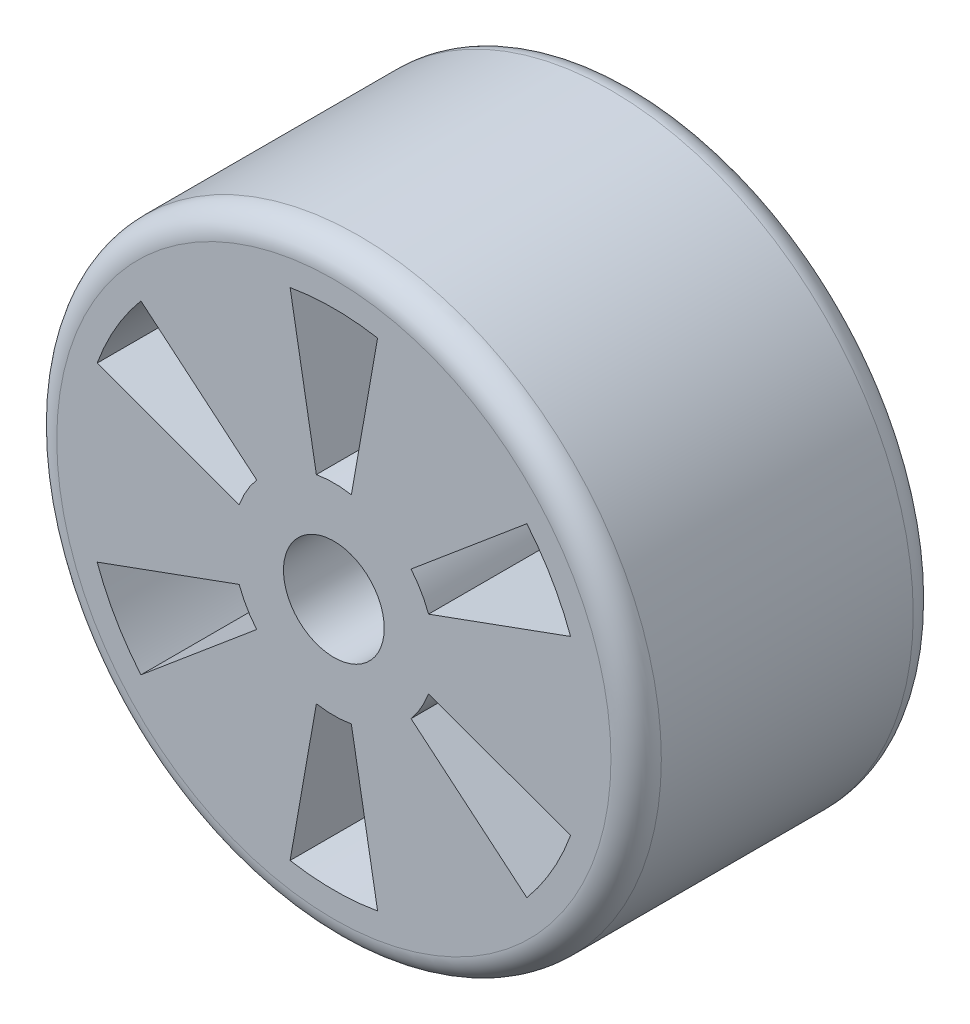
ISO-10303-21;
HEADER;
FILE_DESCRIPTION(('STEP AP214'),'2;1');
FILE_NAME('part.step','',(''),(''),'','','');
FILE_SCHEMA(('AUTOMOTIVE_DESIGN { 1 0 10303 214 1 1 1 1 }'));
ENDSEC;
DATA;
#1=APPLICATION_CONTEXT('core data for automotive mechanical design processes');
#2=APPLICATION_PROTOCOL_DEFINITION('international standard','automotive_design',2000,#1);
#3=PRODUCT_CONTEXT('',#1,'mechanical');
#4=PRODUCT('Part','Part','',(#3));
#5=PRODUCT_RELATED_PRODUCT_CATEGORY('part','',(#4));
#6=PRODUCT_DEFINITION_FORMATION('','',#4);
#7=PRODUCT_DEFINITION_CONTEXT('part definition',#1,'design');
#8=PRODUCT_DEFINITION('design','',#6,#7);
#9=PRODUCT_DEFINITION_SHAPE('','',#8);
#10=(LENGTH_UNIT() NAMED_UNIT(*) SI_UNIT(.MILLI.,.METRE.));
#11=(NAMED_UNIT(*) PLANE_ANGLE_UNIT() SI_UNIT($,.RADIAN.));
#12=(NAMED_UNIT(*) SI_UNIT($,.STERADIAN.) SOLID_ANGLE_UNIT());
#13=UNCERTAINTY_MEASURE_WITH_UNIT(LENGTH_MEASURE(1.E-05),#10,'distance_accuracy_value','');
#14=(GEOMETRIC_REPRESENTATION_CONTEXT(3) GLOBAL_UNCERTAINTY_ASSIGNED_CONTEXT((#13)) GLOBAL_UNIT_ASSIGNED_CONTEXT((#10,
#11,#12)) REPRESENTATION_CONTEXT('',''));
#15=CARTESIAN_POINT('',(0.,0.,0.));
#16=DIRECTION('',(0.,0.,1.));
#17=DIRECTION('',(1.,0.,0.));
#18=AXIS2_PLACEMENT_3D('',#15,#16,#17);
#19=CARTESIAN_POINT('',(0.,0.,-60.));
#20=DIRECTION('',(0.,0.,1.));
#21=DIRECTION('',(1.,0.,0.));
#22=AXIS2_PLACEMENT_3D('',#19,#20,#21);
#23=CYLINDRICAL_SURFACE('',#22,60.);
#24=CARTESIAN_POINT('',(0.,0.,-55.));
#25=DIRECTION('',(0.,0.,1.));
#26=DIRECTION('',(1.,0.,0.));
#27=AXIS2_PLACEMENT_3D('',#24,#25,#26);
#28=CIRCLE('',#27,60.);
#29=CARTESIAN_POINT('',(60.,0.,-55.));
#30=VERTEX_POINT('',#29);
#31=EDGE_CURVE('E482',#30,#30,#28,.T.);
#32=ORIENTED_EDGE('',*,*,#31,.T.);
#33=EDGE_LOOP('',(#32));
#34=FACE_BOUND('',#33,.T.);
#35=CARTESIAN_POINT('',(0.,0.,-5.));
#36=DIRECTION('',(0.,0.,1.));
#37=DIRECTION('',(1.,0.,0.));
#38=AXIS2_PLACEMENT_3D('',#35,#36,#37);
#39=CIRCLE('',#38,60.);
#40=CARTESIAN_POINT('',(60.,0.,-5.));
#41=VERTEX_POINT('',#40);
#42=EDGE_CURVE('E475',#41,#41,#39,.F.);
#43=ORIENTED_EDGE('',*,*,#42,.T.);
#44=EDGE_LOOP('',(#43));
#45=FACE_BOUND('',#44,.T.);
#46=ADVANCED_FACE('F39',(#34,#45),#23,.T.);
#47=CARTESIAN_POINT('',(0.,0.,-60.));
#48=DIRECTION('',(0.,0.,1.));
#49=DIRECTION('',(1.,0.,0.));
#50=AXIS2_PLACEMENT_3D('',#47,#48,#49);
#51=PLANE('',#50);
#52=CARTESIAN_POINT('',(0.,0.,-60.));
#53=DIRECTION('',(0.,0.,1.));
#54=DIRECTION('',(1.,0.,0.));
#55=AXIS2_PLACEMENT_3D('',#52,#53,#54);
#56=CIRCLE('',#55,55.);
#57=CARTESIAN_POINT('',(55.,0.,-60.));
#58=VERTEX_POINT('',#57);
#59=EDGE_CURVE('E48',#58,#58,#56,.F.);
#60=ORIENTED_EDGE('',*,*,#59,.T.);
#61=EDGE_LOOP('',(#60));
#62=FACE_BOUND('',#61,.T.);
#63=DIRECTION('',(0.939692620785905,0.342020143325679,0.));
#64=VECTOR('',#63,1.);
#65=CARTESIAN_POINT('',(46.9846310392953,17.101007166284,-60.));
#66=LINE('',#65,#64);
#67=CARTESIAN_POINT('',(18.7938524157181,6.84040286651357,-60.));
#68=VERTEX_POINT('',#67);
#69=CARTESIAN_POINT('',(46.9846310392953,17.101007166284,-60.));
#70=VERTEX_POINT('',#69);
#71=EDGE_CURVE('E373',#68,#70,#66,.T.);
#72=ORIENTED_EDGE('',*,*,#71,.T.);
#73=CARTESIAN_POINT('',(0.,0.,-60.));
#74=DIRECTION('',(0.,0.,1.));
#75=DIRECTION('',(0.50000000000001,-0.866025403784433,0.));
#76=AXIS2_PLACEMENT_3D('',#73,#74,#75);
#77=CIRCLE('',#76,50.0000000000001);
#78=CARTESIAN_POINT('',(38.3022221559485,32.1393804843275,-60.));
#79=VERTEX_POINT('',#78);
#80=EDGE_CURVE('E306',#70,#79,#77,.T.);
#81=ORIENTED_EDGE('',*,*,#80,.T.);
#82=DIRECTION('',(-0.76604444311897,-0.642787609686549,0.));
#83=VECTOR('',#82,1.);
#84=CARTESIAN_POINT('',(38.3022221559485,32.1393804843275,-60.));
#85=LINE('',#84,#83);
#86=CARTESIAN_POINT('',(15.3208888623794,12.855752193731,-60.));
#87=VERTEX_POINT('',#86);
#88=EDGE_CURVE('E346',#79,#87,#85,.T.);
#89=ORIENTED_EDGE('',*,*,#88,.T.);
#90=CARTESIAN_POINT('',(0.,0.,-60.));
#91=DIRECTION('',(0.,0.,-1.));
#92=DIRECTION('',(0.50000000000001,-0.866025403784433,0.));
#93=AXIS2_PLACEMENT_3D('',#90,#91,#92);
#94=CIRCLE('',#93,20.);
#95=EDGE_CURVE('E55',#87,#68,#94,.T.);
#96=ORIENTED_EDGE('',*,*,#95,.T.);
#97=EDGE_LOOP('',(#72,#81,#89,#96));
#98=FACE_BOUND('',#97,.T.);
#99=DIRECTION('',(0.766044443118983,-0.642787609686533,0.));
#100=VECTOR('',#99,1.);
#101=CARTESIAN_POINT('',(38.3022221559492,-32.1393804843267,-60.));
#102=LINE('',#101,#100);
#103=CARTESIAN_POINT('',(15.3208888623797,-12.8557521937307,-60.));
#104=VERTEX_POINT('',#103);
#105=CARTESIAN_POINT('',(38.3022221559492,-32.1393804843267,-60.));
#106=VERTEX_POINT('',#105);
#107=EDGE_CURVE('E333',#104,#106,#102,.T.);
#108=ORIENTED_EDGE('',*,*,#107,.T.);
#109=CARTESIAN_POINT('',(0.,0.,-60.));
#110=DIRECTION('',(0.,0.,1.));
#111=DIRECTION('',(-0.499999999999992,-0.866025403784443,0.));
#112=AXIS2_PLACEMENT_3D('',#109,#110,#111);
#113=CIRCLE('',#112,50.0000000000001);
#114=CARTESIAN_POINT('',(46.9846310392956,-17.101007166283,-60.));
#115=VERTEX_POINT('',#114);
#116=EDGE_CURVE('E262',#106,#115,#113,.T.);
#117=ORIENTED_EDGE('',*,*,#116,.T.);
#118=DIRECTION('',(-0.939692620785912,0.342020143325659,0.));
#119=VECTOR('',#118,1.);
#120=CARTESIAN_POINT('',(46.9846310392956,-17.101007166283,-60.));
#121=LINE('',#120,#119);
#122=CARTESIAN_POINT('',(18.7938524157182,-6.84040286651318,-60.));
#123=VERTEX_POINT('',#122);
#124=EDGE_CURVE('E305',#115,#123,#121,.T.);
#125=ORIENTED_EDGE('',*,*,#124,.T.);
#126=CARTESIAN_POINT('',(0.,0.,-60.));
#127=DIRECTION('',(0.,0.,-1.));
#128=DIRECTION('',(-0.499999999999992,-0.866025403784443,0.));
#129=AXIS2_PLACEMENT_3D('',#126,#127,#128);
#130=CIRCLE('',#129,20.);
#131=EDGE_CURVE('E63',#123,#104,#130,.T.);
#132=ORIENTED_EDGE('',*,*,#131,.T.);
#133=EDGE_LOOP('',(#108,#117,#125,#132));
#134=FACE_BOUND('',#133,.T.);
#135=DIRECTION('',(-0.173648177666931,-0.984807753012208,0.));
#136=VECTOR('',#135,1.);
#137=CARTESIAN_POINT('',(-8.68240888334658,-49.2403876506105,-60.));
#138=LINE('',#137,#136);
#139=CARTESIAN_POINT('',(-3.47296355333863,-19.6961550602442,-60.));
#140=VERTEX_POINT('',#139);
#141=CARTESIAN_POINT('',(-8.68240888334658,-49.2403876506105,-60.));
#142=VERTEX_POINT('',#141);
#143=EDGE_CURVE('E292',#140,#142,#138,.T.);
#144=ORIENTED_EDGE('',*,*,#143,.T.);
#145=CARTESIAN_POINT('',(0.,0.,-60.));
#146=DIRECTION('',(0.,0.,1.));
#147=DIRECTION('',(-1.,0.,0.));
#148=AXIS2_PLACEMENT_3D('',#145,#146,#147);
#149=CIRCLE('',#148,50.0000000000001);
#150=CARTESIAN_POINT('',(8.68240888334658,-49.2403876506105,-60.));
#151=VERTEX_POINT('',#150);
#152=EDGE_CURVE('E216',#142,#151,#149,.T.);
#153=ORIENTED_EDGE('',*,*,#152,.T.);
#154=DIRECTION('',(-0.173648177666931,0.984807753012208,0.));
#155=VECTOR('',#154,1.);
#156=CARTESIAN_POINT('',(8.68240888334658,-49.2403876506105,-60.));
#157=LINE('',#156,#155);
#158=CARTESIAN_POINT('',(3.47296355333863,-19.6961550602442,-60.));
#159=VERTEX_POINT('',#158);
#160=EDGE_CURVE('E261',#151,#159,#157,.T.);
#161=ORIENTED_EDGE('',*,*,#160,.T.);
#162=CARTESIAN_POINT('',(0.,0.,-60.));
#163=DIRECTION('',(0.,0.,-1.));
#164=DIRECTION('',(-1.,0.,0.));
#165=AXIS2_PLACEMENT_3D('',#162,#163,#164);
#166=CIRCLE('',#165,20.);
#167=EDGE_CURVE('E281',#159,#140,#166,.T.);
#168=ORIENTED_EDGE('',*,*,#167,.T.);
#169=EDGE_LOOP('',(#144,#153,#161,#168));
#170=FACE_BOUND('',#169,.T.);
#171=DIRECTION('',(-0.939692620785907,-0.342020143325672,0.));
#172=VECTOR('',#171,1.);
#173=CARTESIAN_POINT('',(-46.9846310392954,-17.1010071662836,-60.));
#174=LINE('',#173,#172);
#175=CARTESIAN_POINT('',(-18.7938524157181,-6.84040286651344,-60.));
#176=VERTEX_POINT('',#175);
#177=CARTESIAN_POINT('',(-46.9846310392954,-17.1010071662836,-60.));
#178=VERTEX_POINT('',#177);
#179=EDGE_CURVE('E246',#176,#178,#174,.T.);
#180=ORIENTED_EDGE('',*,*,#179,.T.);
#181=CARTESIAN_POINT('',(0.,0.,-60.));
#182=DIRECTION('',(0.,0.,1.));
#183=DIRECTION('',(-0.500000000000004,0.866025403784436,0.));
#184=AXIS2_PLACEMENT_3D('',#181,#182,#183);
#185=CIRCLE('',#184,50.0000000000001);
#186=CARTESIAN_POINT('',(-38.3022221559488,-32.1393804843272,-60.));
#187=VERTEX_POINT('',#186);
#188=EDGE_CURVE('E253',#178,#187,#185,.T.);
#189=ORIENTED_EDGE('',*,*,#188,.T.);
#190=DIRECTION('',(0.766044443118975,0.642787609686544,0.));
#191=VECTOR('',#190,1.);
#192=CARTESIAN_POINT('',(-38.3022221559488,-32.1393804843272,-60.));
#193=LINE('',#192,#191);
#194=CARTESIAN_POINT('',(-15.3208888623795,-12.8557521937309,-60.));
#195=VERTEX_POINT('',#194);
#196=EDGE_CURVE('E215',#187,#195,#193,.T.);
#197=ORIENTED_EDGE('',*,*,#196,.T.);
#198=CARTESIAN_POINT('',(0.,0.,-60.));
#199=DIRECTION('',(0.,0.,-1.));
#200=DIRECTION('',(-0.500000000000004,0.866025403784436,0.));
#201=AXIS2_PLACEMENT_3D('',#198,#199,#200);
#202=CIRCLE('',#201,20.);
#203=EDGE_CURVE('E223',#195,#176,#202,.T.);
#204=ORIENTED_EDGE('',*,*,#203,.T.);
#205=EDGE_LOOP('',(#180,#189,#197,#204));
#206=FACE_BOUND('',#205,.T.);
#207=DIRECTION('',(-0.766044443118979,0.642787609686538,0.));
#208=VECTOR('',#207,1.);
#209=CARTESIAN_POINT('',(-38.302222155949,32.139380484327,-60.));
#210=LINE('',#209,#208);
#211=CARTESIAN_POINT('',(-15.3208888623796,12.8557521937308,-60.));
#212=VERTEX_POINT('',#211);
#213=CARTESIAN_POINT('',(-38.302222155949,32.139380484327,-60.));
#214=VERTEX_POINT('',#213);
#215=EDGE_CURVE('E415',#212,#214,#210,.T.);
#216=ORIENTED_EDGE('',*,*,#215,.T.);
#217=CARTESIAN_POINT('',(0.,0.,-60.));
#218=DIRECTION('',(0.,0.,1.));
#219=DIRECTION('',(0.499999999999998,0.86602540378444,0.));
#220=AXIS2_PLACEMENT_3D('',#217,#218,#219);
#221=CIRCLE('',#220,50.0000000000001);
#222=CARTESIAN_POINT('',(-46.9846310392955,17.1010071662833,-60.));
#223=VERTEX_POINT('',#222);
#224=EDGE_CURVE('E422',#214,#223,#221,.T.);
#225=ORIENTED_EDGE('',*,*,#224,.T.);
#226=DIRECTION('',(0.93969262078591,-0.342020143325666,0.));
#227=VECTOR('',#226,1.);
#228=CARTESIAN_POINT('',(-46.9846310392955,17.1010071662833,-60.));
#229=LINE('',#228,#227);
#230=CARTESIAN_POINT('',(-18.7938524157182,6.84040286651331,-60.));
#231=VERTEX_POINT('',#230);
#232=EDGE_CURVE('E385',#223,#231,#229,.T.);
#233=ORIENTED_EDGE('',*,*,#232,.T.);
#234=CARTESIAN_POINT('',(0.,0.,-60.));
#235=DIRECTION('',(0.,0.,-1.));
#236=DIRECTION('',(0.499999999999998,0.86602540378444,0.));
#237=AXIS2_PLACEMENT_3D('',#234,#235,#236);
#238=CIRCLE('',#237,20.);
#239=EDGE_CURVE('E404',#231,#212,#238,.T.);
#240=ORIENTED_EDGE('',*,*,#239,.T.);
#241=EDGE_LOOP('',(#216,#225,#233,#240));
#242=FACE_BOUND('',#241,.T.);
#243=DIRECTION('',(0.173648177666931,0.984807753012208,0.));
#244=VECTOR('',#243,1.);
#245=CARTESIAN_POINT('',(8.68240888334658,49.2403876506105,-60.));
#246=LINE('',#245,#244);
#247=CARTESIAN_POINT('',(3.47296355333863,19.6961550602442,-60.));
#248=VERTEX_POINT('',#247);
#249=CARTESIAN_POINT('',(8.68240888334658,49.2403876506105,-60.));
#250=VERTEX_POINT('',#249);
#251=EDGE_CURVE('E440',#248,#250,#246,.T.);
#252=ORIENTED_EDGE('',*,*,#251,.T.);
#253=CARTESIAN_POINT('',(0.,0.,-60.));
#254=DIRECTION('',(0.,0.,1.));
#255=DIRECTION('',(1.,0.,0.));
#256=AXIS2_PLACEMENT_3D('',#253,#254,#255);
#257=CIRCLE('',#256,50.0000000000001);
#258=CARTESIAN_POINT('',(-8.68240888334658,49.2403876506105,-60.));
#259=VERTEX_POINT('',#258);
#260=EDGE_CURVE('E427',#250,#259,#257,.T.);
#261=ORIENTED_EDGE('',*,*,#260,.T.);
#262=DIRECTION('',(0.173648177666931,-0.984807753012208,0.));
#263=VECTOR('',#262,1.);
#264=CARTESIAN_POINT('',(-8.68240888334658,49.2403876506105,-60.));
#265=LINE('',#264,#263);
#266=CARTESIAN_POINT('',(-3.47296355333863,19.6961550602442,-60.));
#267=VERTEX_POINT('',#266);
#268=EDGE_CURVE('E431',#259,#267,#265,.T.);
#269=ORIENTED_EDGE('',*,*,#268,.T.);
#270=CARTESIAN_POINT('',(0.,0.,-60.));
#271=DIRECTION('',(0.,0.,-1.));
#272=DIRECTION('',(1.,0.,0.));
#273=AXIS2_PLACEMENT_3D('',#270,#271,#272);
#274=CIRCLE('',#273,20.);
#275=EDGE_CURVE('E436',#267,#248,#274,.T.);
#276=ORIENTED_EDGE('',*,*,#275,.T.);
#277=EDGE_LOOP('',(#252,#261,#269,#276));
#278=FACE_BOUND('',#277,.T.);
#279=CARTESIAN_POINT('',(0.,0.,-60.));
#280=DIRECTION('',(0.,0.,1.));
#281=DIRECTION('',(1.,0.,0.));
#282=AXIS2_PLACEMENT_3D('',#279,#280,#281);
#283=CIRCLE('',#282,10.);
#284=CARTESIAN_POINT('',(10.,0.,-60.));
#285=VERTEX_POINT('',#284);
#286=EDGE_CURVE('E471',#285,#285,#283,.T.);
#287=ORIENTED_EDGE('',*,*,#286,.T.);
#288=EDGE_LOOP('',(#287));
#289=FACE_BOUND('',#288,.T.);
#290=ADVANCED_FACE('F489',(#62,#98,#134,#170,#206,#242,#278,#289),#51,.F.);
#291=CARTESIAN_POINT('',(0.,0.,0.));
#292=DIRECTION('',(0.,0.,1.));
#293=DIRECTION('',(1.,0.,0.));
#294=AXIS2_PLACEMENT_3D('',#291,#292,#293);
#295=PLANE('',#294);
#296=CARTESIAN_POINT('',(0.,0.,0.));
#297=DIRECTION('',(0.,0.,1.));
#298=DIRECTION('',(1.,0.,0.));
#299=AXIS2_PLACEMENT_3D('',#296,#297,#298);
#300=CIRCLE('',#299,55.);
#301=CARTESIAN_POINT('',(55.,0.,0.));
#302=VERTEX_POINT('',#301);
#303=EDGE_CURVE('E11',#302,#302,#300,.T.);
#304=ORIENTED_EDGE('',*,*,#303,.T.);
#305=EDGE_LOOP('',(#304));
#306=FACE_BOUND('',#305,.T.);
#307=CARTESIAN_POINT('',(0.,0.,0.));
#308=DIRECTION('',(0.,0.,1.));
#309=DIRECTION('',(0.50000000000001,-0.866025403784433,0.));
#310=AXIS2_PLACEMENT_3D('',#307,#308,#309);
#311=CIRCLE('',#310,50.0000000000001);
#312=CARTESIAN_POINT('',(46.9846310392953,17.101007166284,0.));
#313=VERTEX_POINT('',#312);
#314=CARTESIAN_POINT('',(38.3022221559485,32.1393804843275,0.));
#315=VERTEX_POINT('',#314);
#316=EDGE_CURVE('E377',#313,#315,#311,.T.);
#317=ORIENTED_EDGE('',*,*,#316,.F.);
#318=DIRECTION('',(0.939692620785905,0.342020143325679,0.));
#319=VECTOR('',#318,1.);
#320=CARTESIAN_POINT('',(46.9846310392953,17.101007166284,0.));
#321=LINE('',#320,#319);
#322=CARTESIAN_POINT('',(18.7938524157181,6.84040286651357,0.));
#323=VERTEX_POINT('',#322);
#324=EDGE_CURVE('E366',#323,#313,#321,.T.);
#325=ORIENTED_EDGE('',*,*,#324,.F.);
#326=CARTESIAN_POINT('',(0.,0.,0.));
#327=DIRECTION('',(0.,0.,-1.));
#328=DIRECTION('',(0.50000000000001,-0.866025403784433,0.));
#329=AXIS2_PLACEMENT_3D('',#326,#327,#328);
#330=CIRCLE('',#329,20.);
#331=CARTESIAN_POINT('',(15.3208888623794,12.855752193731,0.));
#332=VERTEX_POINT('',#331);
#333=EDGE_CURVE('E357',#332,#323,#330,.T.);
#334=ORIENTED_EDGE('',*,*,#333,.F.);
#335=DIRECTION('',(-0.76604444311897,-0.642787609686549,0.));
#336=VECTOR('',#335,1.);
#337=CARTESIAN_POINT('',(38.3022221559485,32.1393804843275,0.));
#338=LINE('',#337,#336);
#339=EDGE_CURVE('E343',#315,#332,#338,.T.);
#340=ORIENTED_EDGE('',*,*,#339,.F.);
#341=EDGE_LOOP('',(#317,#325,#334,#340));
#342=FACE_BOUND('',#341,.T.);
#343=CARTESIAN_POINT('',(0.,0.,0.));
#344=DIRECTION('',(0.,0.,1.));
#345=DIRECTION('',(-0.499999999999992,-0.866025403784443,0.));
#346=AXIS2_PLACEMENT_3D('',#343,#344,#345);
#347=CIRCLE('',#346,50.0000000000001);
#348=CARTESIAN_POINT('',(38.3022221559492,-32.1393804843267,0.));
#349=VERTEX_POINT('',#348);
#350=CARTESIAN_POINT('',(46.9846310392957,-17.101007166283,0.));
#351=VERTEX_POINT('',#350);
#352=EDGE_CURVE('E337',#349,#351,#347,.T.);
#353=ORIENTED_EDGE('',*,*,#352,.F.);
#354=DIRECTION('',(0.766044443118983,-0.642787609686533,0.));
#355=VECTOR('',#354,1.);
#356=CARTESIAN_POINT('',(38.3022221559492,-32.1393804843267,0.));
#357=LINE('',#356,#355);
#358=CARTESIAN_POINT('',(15.3208888623797,-12.8557521937307,0.));
#359=VERTEX_POINT('',#358);
#360=EDGE_CURVE('E326',#359,#349,#357,.T.);
#361=ORIENTED_EDGE('',*,*,#360,.F.);
#362=CARTESIAN_POINT('',(0.,0.,0.));
#363=DIRECTION('',(0.,0.,-1.));
#364=DIRECTION('',(-0.499999999999992,-0.866025403784443,0.));
#365=AXIS2_PLACEMENT_3D('',#362,#363,#364);
#366=CIRCLE('',#365,20.);
#367=CARTESIAN_POINT('',(18.7938524157182,-6.84040286651318,0.));
#368=VERTEX_POINT('',#367);
#369=EDGE_CURVE('E317',#368,#359,#366,.T.);
#370=ORIENTED_EDGE('',*,*,#369,.F.);
#371=DIRECTION('',(-0.939692620785912,0.342020143325659,0.));
#372=VECTOR('',#371,1.);
#373=CARTESIAN_POINT('',(46.9846310392956,-17.101007166283,0.));
#374=LINE('',#373,#372);
#375=EDGE_CURVE('E302',#351,#368,#374,.T.);
#376=ORIENTED_EDGE('',*,*,#375,.F.);
#377=EDGE_LOOP('',(#353,#361,#370,#376));
#378=FACE_BOUND('',#377,.T.);
#379=CARTESIAN_POINT('',(0.,0.,0.));
#380=DIRECTION('',(0.,0.,1.));
#381=DIRECTION('',(-1.,0.,0.));
#382=AXIS2_PLACEMENT_3D('',#379,#380,#381);
#383=CIRCLE('',#382,50.0000000000001);
#384=CARTESIAN_POINT('',(-8.68240888334658,-49.2403876506105,0.));
#385=VERTEX_POINT('',#384);
#386=CARTESIAN_POINT('',(8.68240888334658,-49.2403876506105,0.));
#387=VERTEX_POINT('',#386);
#388=EDGE_CURVE('E296',#385,#387,#383,.T.);
#389=ORIENTED_EDGE('',*,*,#388,.F.);
#390=DIRECTION('',(-0.173648177666931,-0.984807753012208,0.));
#391=VECTOR('',#390,1.);
#392=CARTESIAN_POINT('',(-8.68240888334658,-49.2403876506105,0.));
#393=LINE('',#392,#391);
#394=CARTESIAN_POINT('',(-3.47296355333863,-19.6961550602442,0.));
#395=VERTEX_POINT('',#394);
#396=EDGE_CURVE('E285',#395,#385,#393,.T.);
#397=ORIENTED_EDGE('',*,*,#396,.F.);
#398=CARTESIAN_POINT('',(0.,0.,0.));
#399=DIRECTION('',(0.,0.,-1.));
#400=DIRECTION('',(-1.,0.,0.));
#401=AXIS2_PLACEMENT_3D('',#398,#399,#400);
#402=CIRCLE('',#401,20.);
#403=CARTESIAN_POINT('',(3.47296355333863,-19.6961550602442,0.));
#404=VERTEX_POINT('',#403);
#405=EDGE_CURVE('E274',#404,#395,#402,.T.);
#406=ORIENTED_EDGE('',*,*,#405,.F.);
#407=DIRECTION('',(-0.173648177666931,0.984807753012208,0.));
#408=VECTOR('',#407,1.);
#409=CARTESIAN_POINT('',(8.68240888334658,-49.2403876506105,0.));
#410=LINE('',#409,#408);
#411=EDGE_CURVE('E258',#387,#404,#410,.T.);
#412=ORIENTED_EDGE('',*,*,#411,.F.);
#413=EDGE_LOOP('',(#389,#397,#406,#412));
#414=FACE_BOUND('',#413,.T.);
#415=CARTESIAN_POINT('',(0.,0.,0.));
#416=DIRECTION('',(0.,0.,1.));
#417=DIRECTION('',(-0.500000000000004,0.866025403784436,0.));
#418=AXIS2_PLACEMENT_3D('',#415,#416,#417);
#419=CIRCLE('',#418,50.0000000000001);
#420=CARTESIAN_POINT('',(-46.9846310392954,-17.1010071662836,0.));
#421=VERTEX_POINT('',#420);
#422=CARTESIAN_POINT('',(-38.3022221559488,-32.1393804843272,0.));
#423=VERTEX_POINT('',#422);
#424=EDGE_CURVE('E250',#421,#423,#419,.T.);
#425=ORIENTED_EDGE('',*,*,#424,.F.);
#426=DIRECTION('',(-0.939692620785907,-0.342020143325672,0.));
#427=VECTOR('',#426,1.);
#428=CARTESIAN_POINT('',(-46.9846310392954,-17.1010071662836,0.));
#429=LINE('',#428,#427);
#430=CARTESIAN_POINT('',(-18.7938524157181,-6.84040286651344,0.));
#431=VERTEX_POINT('',#430);
#432=EDGE_CURVE('E229',#431,#421,#429,.T.);
#433=ORIENTED_EDGE('',*,*,#432,.F.);
#434=CARTESIAN_POINT('',(0.,0.,0.));
#435=DIRECTION('',(0.,0.,-1.));
#436=DIRECTION('',(-0.500000000000004,0.866025403784436,0.));
#437=AXIS2_PLACEMENT_3D('',#434,#435,#436);
#438=CIRCLE('',#437,20.);
#439=CARTESIAN_POINT('',(-15.3208888623795,-12.8557521937309,0.));
#440=VERTEX_POINT('',#439);
#441=EDGE_CURVE('E220',#440,#431,#438,.T.);
#442=ORIENTED_EDGE('',*,*,#441,.F.);
#443=DIRECTION('',(0.766044443118975,0.642787609686544,0.));
#444=VECTOR('',#443,1.);
#445=CARTESIAN_POINT('',(-38.3022221559488,-32.1393804843272,0.));
#446=LINE('',#445,#444);
#447=EDGE_CURVE('E204',#423,#440,#446,.T.);
#448=ORIENTED_EDGE('',*,*,#447,.F.);
#449=EDGE_LOOP('',(#425,#433,#442,#448));
#450=FACE_BOUND('',#449,.T.);
#451=CARTESIAN_POINT('',(0.,0.,0.));
#452=DIRECTION('',(0.,0.,1.));
#453=DIRECTION('',(0.499999999999998,0.86602540378444,0.));
#454=AXIS2_PLACEMENT_3D('',#451,#452,#453);
#455=CIRCLE('',#454,50.0000000000001);
#456=CARTESIAN_POINT('',(-38.302222155949,32.139380484327,0.));
#457=VERTEX_POINT('',#456);
#458=CARTESIAN_POINT('',(-46.9846310392955,17.1010071662833,0.));
#459=VERTEX_POINT('',#458);
#460=EDGE_CURVE('E419',#457,#459,#455,.T.);
#461=ORIENTED_EDGE('',*,*,#460,.F.);
#462=DIRECTION('',(-0.766044443118979,0.642787609686538,0.));
#463=VECTOR('',#462,1.);
#464=CARTESIAN_POINT('',(-38.302222155949,32.139380484327,0.));
#465=LINE('',#464,#463);
#466=CARTESIAN_POINT('',(-15.3208888623796,12.8557521937308,0.));
#467=VERTEX_POINT('',#466);
#468=EDGE_CURVE('E408',#467,#457,#465,.T.);
#469=ORIENTED_EDGE('',*,*,#468,.F.);
#470=CARTESIAN_POINT('',(0.,0.,0.));
#471=DIRECTION('',(0.,0.,-1.));
#472=DIRECTION('',(0.499999999999998,0.86602540378444,0.));
#473=AXIS2_PLACEMENT_3D('',#470,#471,#472);
#474=CIRCLE('',#473,20.);
#475=CARTESIAN_POINT('',(-18.7938524157182,6.84040286651331,0.));
#476=VERTEX_POINT('',#475);
#477=EDGE_CURVE('E397',#476,#467,#474,.T.);
#478=ORIENTED_EDGE('',*,*,#477,.F.);
#479=DIRECTION('',(0.93969262078591,-0.342020143325666,0.));
#480=VECTOR('',#479,1.);
#481=CARTESIAN_POINT('',(-46.9846310392955,17.1010071662833,0.));
#482=LINE('',#481,#480);
#483=EDGE_CURVE('E257',#459,#476,#482,.T.);
#484=ORIENTED_EDGE('',*,*,#483,.F.);
#485=EDGE_LOOP('',(#461,#469,#478,#484));
#486=FACE_BOUND('',#485,.T.);
#487=CARTESIAN_POINT('',(0.,0.,0.));
#488=DIRECTION('',(0.,0.,1.));
#489=DIRECTION('',(1.,0.,0.));
#490=AXIS2_PLACEMENT_3D('',#487,#488,#489);
#491=CIRCLE('',#490,50.0000000000001);
#492=CARTESIAN_POINT('',(8.68240888334658,49.2403876506105,0.));
#493=VERTEX_POINT('',#492);
#494=CARTESIAN_POINT('',(-8.68240888334658,49.2403876506105,0.));
#495=VERTEX_POINT('',#494);
#496=EDGE_CURVE('E426',#493,#495,#491,.T.);
#497=ORIENTED_EDGE('',*,*,#496,.F.);
#498=DIRECTION('',(0.173648177666931,0.984807753012208,0.));
#499=VECTOR('',#498,1.);
#500=CARTESIAN_POINT('',(8.68240888334658,49.2403876506105,0.));
#501=LINE('',#500,#499);
#502=CARTESIAN_POINT('',(3.47296355333863,19.6961550602442,0.));
#503=VERTEX_POINT('',#502);
#504=EDGE_CURVE('E432',#503,#493,#501,.T.);
#505=ORIENTED_EDGE('',*,*,#504,.F.);
#506=CARTESIAN_POINT('',(0.,0.,0.));
#507=DIRECTION('',(0.,0.,-1.));
#508=DIRECTION('',(1.,0.,0.));
#509=AXIS2_PLACEMENT_3D('',#506,#507,#508);
#510=CIRCLE('',#509,20.);
#511=CARTESIAN_POINT('',(-3.47296355333863,19.6961550602442,0.));
#512=VERTEX_POINT('',#511);
#513=EDGE_CURVE('E451',#512,#503,#510,.T.);
#514=ORIENTED_EDGE('',*,*,#513,.F.);
#515=DIRECTION('',(0.173648177666931,-0.984807753012208,0.));
#516=VECTOR('',#515,1.);
#517=CARTESIAN_POINT('',(-8.68240888334658,49.2403876506105,0.));
#518=LINE('',#517,#516);
#519=EDGE_CURVE('E447',#495,#512,#518,.T.);
#520=ORIENTED_EDGE('',*,*,#519,.F.);
#521=EDGE_LOOP('',(#497,#505,#514,#520));
#522=FACE_BOUND('',#521,.T.);
#523=CARTESIAN_POINT('',(0.,0.,0.));
#524=DIRECTION('',(0.,0.,1.));
#525=DIRECTION('',(1.,0.,0.));
#526=AXIS2_PLACEMENT_3D('',#523,#524,#525);
#527=CIRCLE('',#526,10.);
#528=CARTESIAN_POINT('',(10.,0.,0.));
#529=VERTEX_POINT('',#528);
#530=EDGE_CURVE('E461',#529,#529,#527,.T.);
#531=ORIENTED_EDGE('',*,*,#530,.F.);
#532=EDGE_LOOP('',(#531));
#533=FACE_BOUND('',#532,.T.);
#534=ADVANCED_FACE('F227',(#306,#342,#378,#414,#450,#486,#522,#533),#295,.T.);
#535=CARTESIAN_POINT('',(0.,0.,-60.));
#536=DIRECTION('',(0.,0.,1.));
#537=DIRECTION('',(1.,0.,0.));
#538=AXIS2_PLACEMENT_3D('',#535,#536,#537);
#539=CYLINDRICAL_SURFACE('',#538,10.);
#540=ORIENTED_EDGE('',*,*,#286,.F.);
#541=EDGE_LOOP('',(#540));
#542=FACE_BOUND('',#541,.T.);
#543=ORIENTED_EDGE('',*,*,#530,.T.);
#544=EDGE_LOOP('',(#543));
#545=FACE_BOUND('',#544,.T.);
#546=ADVANCED_FACE('F509',(#542,#545),#539,.F.);
#547=CARTESIAN_POINT('',(0.,0.,-60.));
#548=DIRECTION('',(0.,0.,1.));
#549=DIRECTION('',(1.,0.,0.));
#550=AXIS2_PLACEMENT_3D('',#547,#548,#549);
#551=CYLINDRICAL_SURFACE('',#550,50.0000000000001);
#552=ORIENTED_EDGE('',*,*,#496,.T.);
#553=DIRECTION('',(0.,0.,1.));
#554=VECTOR('',#553,1.);
#555=CARTESIAN_POINT('',(-8.68240888334658,49.2403876506105,-60.));
#556=LINE('',#555,#554);
#557=EDGE_CURVE('E444',#259,#495,#556,.T.);
#558=ORIENTED_EDGE('',*,*,#557,.F.);
#559=ORIENTED_EDGE('',*,*,#260,.F.);
#560=DIRECTION('',(0.,0.,1.));
#561=VECTOR('',#560,1.);
#562=CARTESIAN_POINT('',(8.68240888334658,49.2403876506105,-60.));
#563=LINE('',#562,#561);
#564=EDGE_CURVE('E458',#250,#493,#563,.T.);
#565=ORIENTED_EDGE('',*,*,#564,.T.);
#566=EDGE_LOOP('',(#552,#558,#559,#565));
#567=FACE_BOUND('',#566,.T.);
#568=ADVANCED_FACE('F600',(#567),#551,.F.);
#569=CARTESIAN_POINT('',(8.68240888334658,49.2403876506105,-60.));
#570=DIRECTION('',(0.984807753012208,-0.173648177666931,0.));
#571=DIRECTION('',(0.173648177666931,0.984807753012208,0.));
#572=AXIS2_PLACEMENT_3D('',#569,#570,#571);
#573=PLANE('',#572);
#574=ORIENTED_EDGE('',*,*,#504,.T.);
#575=ORIENTED_EDGE('',*,*,#564,.F.);
#576=ORIENTED_EDGE('',*,*,#251,.F.);
#577=DIRECTION('',(0.,0.,1.));
#578=VECTOR('',#577,1.);
#579=CARTESIAN_POINT('',(3.47296355333863,19.6961550602442,-60.));
#580=LINE('',#579,#578);
#581=EDGE_CURVE('E462',#248,#503,#580,.T.);
#582=ORIENTED_EDGE('',*,*,#581,.T.);
#583=EDGE_LOOP('',(#574,#575,#576,#582));
#584=FACE_BOUND('',#583,.T.);
#585=ADVANCED_FACE('F596',(#584),#573,.F.);
#586=CARTESIAN_POINT('',(0.,0.,-60.));
#587=DIRECTION('',(0.,0.,1.));
#588=DIRECTION('',(1.,0.,0.));
#589=AXIS2_PLACEMENT_3D('',#586,#587,#588);
#590=CYLINDRICAL_SURFACE('',#589,20.);
#591=ORIENTED_EDGE('',*,*,#513,.T.);
#592=ORIENTED_EDGE('',*,*,#581,.F.);
#593=ORIENTED_EDGE('',*,*,#275,.F.);
#594=DIRECTION('',(0.,0.,1.));
#595=VECTOR('',#594,1.);
#596=CARTESIAN_POINT('',(-3.47296355333863,19.6961550602442,-60.));
#597=LINE('',#596,#595);
#598=EDGE_CURVE('E465',#267,#512,#597,.T.);
#599=ORIENTED_EDGE('',*,*,#598,.T.);
#600=EDGE_LOOP('',(#591,#592,#593,#599));
#601=FACE_BOUND('',#600,.T.);
#602=ADVANCED_FACE('F599',(#601),#590,.T.);
#603=CARTESIAN_POINT('',(-8.68240888334658,49.2403876506105,-60.));
#604=DIRECTION('',(-0.984807753012208,-0.173648177666931,0.));
#605=DIRECTION('',(0.173648177666931,-0.984807753012208,0.));
#606=AXIS2_PLACEMENT_3D('',#603,#604,#605);
#607=PLANE('',#606);
#608=ORIENTED_EDGE('',*,*,#519,.T.);
#609=ORIENTED_EDGE('',*,*,#598,.F.);
#610=ORIENTED_EDGE('',*,*,#268,.F.);
#611=ORIENTED_EDGE('',*,*,#557,.T.);
#612=EDGE_LOOP('',(#608,#609,#610,#611));
#613=FACE_BOUND('',#612,.T.);
#614=ADVANCED_FACE('F594',(#613),#607,.F.);
#615=CARTESIAN_POINT('',(0.,0.,-60.));
#616=DIRECTION('',(0.,0.,1.));
#617=DIRECTION('',(0.499999999999998,0.86602540378444,0.));
#618=AXIS2_PLACEMENT_3D('',#615,#616,#617);
#619=CYLINDRICAL_SURFACE('',#618,50.0000000000001);
#620=ORIENTED_EDGE('',*,*,#460,.T.);
#621=DIRECTION('',(0.,0.,1.));
#622=VECTOR('',#621,1.);
#623=CARTESIAN_POINT('',(-46.9846310392955,17.1010071662833,-60.));
#624=LINE('',#623,#622);
#625=EDGE_CURVE('E393',#223,#459,#624,.T.);
#626=ORIENTED_EDGE('',*,*,#625,.F.);
#627=ORIENTED_EDGE('',*,*,#224,.F.);
#628=DIRECTION('',(0.,0.,1.));
#629=VECTOR('',#628,1.);
#630=CARTESIAN_POINT('',(-38.302222155949,32.139380484327,-60.));
#631=LINE('',#630,#629);
#632=EDGE_CURVE('E411',#214,#457,#631,.T.);
#633=ORIENTED_EDGE('',*,*,#632,.T.);
#634=EDGE_LOOP('',(#620,#626,#627,#633));
#635=FACE_BOUND('',#634,.T.);
#636=ADVANCED_FACE('F590',(#635),#619,.F.);
#637=CARTESIAN_POINT('',(-38.302222155949,32.139380484327,-60.));
#638=DIRECTION('',(0.642787609686538,0.766044443118979,0.));
#639=DIRECTION('',(-0.766044443118979,0.642787609686538,0.));
#640=AXIS2_PLACEMENT_3D('',#637,#638,#639);
#641=PLANE('',#640);
#642=ORIENTED_EDGE('',*,*,#468,.T.);
#643=ORIENTED_EDGE('',*,*,#632,.F.);
#644=ORIENTED_EDGE('',*,*,#215,.F.);
#645=DIRECTION('',(0.,0.,1.));
#646=VECTOR('',#645,1.);
#647=CARTESIAN_POINT('',(-15.3208888623796,12.8557521937308,-60.));
#648=LINE('',#647,#646);
#649=EDGE_CURVE('E400',#212,#467,#648,.T.);
#650=ORIENTED_EDGE('',*,*,#649,.T.);
#651=EDGE_LOOP('',(#642,#643,#644,#650));
#652=FACE_BOUND('',#651,.T.);
#653=ADVANCED_FACE('F586',(#652),#641,.F.);
#654=CARTESIAN_POINT('',(0.,0.,-60.));
#655=DIRECTION('',(0.,0.,1.));
#656=DIRECTION('',(0.499999999999998,0.86602540378444,0.));
#657=AXIS2_PLACEMENT_3D('',#654,#655,#656);
#658=CYLINDRICAL_SURFACE('',#657,20.);
#659=ORIENTED_EDGE('',*,*,#477,.T.);
#660=ORIENTED_EDGE('',*,*,#649,.F.);
#661=ORIENTED_EDGE('',*,*,#239,.F.);
#662=DIRECTION('',(0.,0.,1.));
#663=VECTOR('',#662,1.);
#664=CARTESIAN_POINT('',(-18.7938524157182,6.84040286651331,-60.));
#665=LINE('',#664,#663);
#666=EDGE_CURVE('E389',#231,#476,#665,.T.);
#667=ORIENTED_EDGE('',*,*,#666,.T.);
#668=EDGE_LOOP('',(#659,#660,#661,#667));
#669=FACE_BOUND('',#668,.T.);
#670=ADVANCED_FACE('F582',(#669),#658,.T.);
#671=CARTESIAN_POINT('',(-46.9846310392955,17.1010071662833,-60.));
#672=DIRECTION('',(-0.342020143325666,-0.93969262078591,0.));
#673=DIRECTION('',(0.93969262078591,-0.342020143325666,0.));
#674=AXIS2_PLACEMENT_3D('',#671,#672,#673);
#675=PLANE('',#674);
#676=ORIENTED_EDGE('',*,*,#483,.T.);
#677=ORIENTED_EDGE('',*,*,#666,.F.);
#678=ORIENTED_EDGE('',*,*,#232,.F.);
#679=ORIENTED_EDGE('',*,*,#625,.T.);
#680=EDGE_LOOP('',(#676,#677,#678,#679));
#681=FACE_BOUND('',#680,.T.);
#682=ADVANCED_FACE('F578',(#681),#675,.F.);
#683=CARTESIAN_POINT('',(0.,0.,-60.));
#684=DIRECTION('',(0.,0.,1.));
#685=DIRECTION('',(-0.500000000000004,0.866025403784436,0.));
#686=AXIS2_PLACEMENT_3D('',#683,#684,#685);
#687=CYLINDRICAL_SURFACE('',#686,50.0000000000001);
#688=ORIENTED_EDGE('',*,*,#424,.T.);
#689=DIRECTION('',(0.,0.,1.));
#690=VECTOR('',#689,1.);
#691=CARTESIAN_POINT('',(-38.3022221559488,-32.1393804843272,-60.));
#692=LINE('',#691,#690);
#693=EDGE_CURVE('E210',#187,#423,#692,.T.);
#694=ORIENTED_EDGE('',*,*,#693,.F.);
#695=ORIENTED_EDGE('',*,*,#188,.F.);
#696=DIRECTION('',(0.,0.,1.));
#697=VECTOR('',#696,1.);
#698=CARTESIAN_POINT('',(-46.9846310392954,-17.1010071662836,-60.));
#699=LINE('',#698,#697);
#700=EDGE_CURVE('E242',#178,#421,#699,.T.);
#701=ORIENTED_EDGE('',*,*,#700,.T.);
#702=EDGE_LOOP('',(#688,#694,#695,#701));
#703=FACE_BOUND('',#702,.T.);
#704=ADVANCED_FACE('F581',(#703),#687,.F.);
#705=CARTESIAN_POINT('',(-46.9846310392954,-17.1010071662836,-60.));
#706=DIRECTION('',(-0.342020143325672,0.939692620785907,0.));
#707=DIRECTION('',(-0.939692620785907,-0.342020143325672,0.));
#708=AXIS2_PLACEMENT_3D('',#705,#706,#707);
#709=PLANE('',#708);
#710=ORIENTED_EDGE('',*,*,#432,.T.);
#711=ORIENTED_EDGE('',*,*,#700,.F.);
#712=ORIENTED_EDGE('',*,*,#179,.F.);
#713=DIRECTION('',(0.,0.,1.));
#714=VECTOR('',#713,1.);
#715=CARTESIAN_POINT('',(-18.7938524157181,-6.84040286651344,-60.));
#716=LINE('',#715,#714);
#717=EDGE_CURVE('E231',#176,#431,#716,.T.);
#718=ORIENTED_EDGE('',*,*,#717,.T.);
#719=EDGE_LOOP('',(#710,#711,#712,#718));
#720=FACE_BOUND('',#719,.T.);
#721=ADVANCED_FACE('F666',(#720),#709,.F.);
#722=CARTESIAN_POINT('',(0.,0.,-60.));
#723=DIRECTION('',(0.,0.,1.));
#724=DIRECTION('',(-0.500000000000004,0.866025403784436,0.));
#725=AXIS2_PLACEMENT_3D('',#722,#723,#724);
#726=CYLINDRICAL_SURFACE('',#725,20.);
#727=ORIENTED_EDGE('',*,*,#441,.T.);
#728=ORIENTED_EDGE('',*,*,#717,.F.);
#729=ORIENTED_EDGE('',*,*,#203,.F.);
#730=DIRECTION('',(0.,0.,1.));
#731=VECTOR('',#730,1.);
#732=CARTESIAN_POINT('',(-15.3208888623795,-12.8557521937309,-60.));
#733=LINE('',#732,#731);
#734=EDGE_CURVE('E207',#195,#440,#733,.T.);
#735=ORIENTED_EDGE('',*,*,#734,.T.);
#736=EDGE_LOOP('',(#727,#728,#729,#735));
#737=FACE_BOUND('',#736,.T.);
#738=ADVANCED_FACE('F219',(#737),#726,.T.);
#739=CARTESIAN_POINT('',(-38.3022221559488,-32.1393804843272,-60.));
#740=DIRECTION('',(0.642787609686544,-0.766044443118974,0.));
#741=DIRECTION('',(0.766044443118975,0.642787609686544,0.));
#742=AXIS2_PLACEMENT_3D('',#739,#740,#741);
#743=PLANE('',#742);
#744=ORIENTED_EDGE('',*,*,#447,.T.);
#745=ORIENTED_EDGE('',*,*,#734,.F.);
#746=ORIENTED_EDGE('',*,*,#196,.F.);
#747=ORIENTED_EDGE('',*,*,#693,.T.);
#748=EDGE_LOOP('',(#744,#745,#746,#747));
#749=FACE_BOUND('',#748,.T.);
#750=ADVANCED_FACE('F206',(#749),#743,.F.);
#751=CARTESIAN_POINT('',(0.,0.,-60.));
#752=DIRECTION('',(0.,0.,1.));
#753=DIRECTION('',(-1.,0.,0.));
#754=AXIS2_PLACEMENT_3D('',#751,#752,#753);
#755=CYLINDRICAL_SURFACE('',#754,50.0000000000001);
#756=ORIENTED_EDGE('',*,*,#388,.T.);
#757=DIRECTION('',(0.,0.,1.));
#758=VECTOR('',#757,1.);
#759=CARTESIAN_POINT('',(8.68240888334658,-49.2403876506105,-60.));
#760=LINE('',#759,#758);
#761=EDGE_CURVE('E270',#151,#387,#760,.T.);
#762=ORIENTED_EDGE('',*,*,#761,.F.);
#763=ORIENTED_EDGE('',*,*,#152,.F.);
#764=DIRECTION('',(0.,0.,1.));
#765=VECTOR('',#764,1.);
#766=CARTESIAN_POINT('',(-8.68240888334658,-49.2403876506105,-60.));
#767=LINE('',#766,#765);
#768=EDGE_CURVE('E288',#142,#385,#767,.T.);
#769=ORIENTED_EDGE('',*,*,#768,.T.);
#770=EDGE_LOOP('',(#756,#762,#763,#769));
#771=FACE_BOUND('',#770,.T.);
#772=ADVANCED_FACE('F525',(#771),#755,.F.);
#773=CARTESIAN_POINT('',(-8.68240888334658,-49.2403876506105,-60.));
#774=DIRECTION('',(-0.984807753012208,0.173648177666931,0.));
#775=DIRECTION('',(-0.173648177666931,-0.984807753012208,0.));
#776=AXIS2_PLACEMENT_3D('',#773,#774,#775);
#777=PLANE('',#776);
#778=ORIENTED_EDGE('',*,*,#396,.T.);
#779=ORIENTED_EDGE('',*,*,#768,.F.);
#780=ORIENTED_EDGE('',*,*,#143,.F.);
#781=DIRECTION('',(0.,0.,1.));
#782=VECTOR('',#781,1.);
#783=CARTESIAN_POINT('',(-3.47296355333863,-19.6961550602442,-60.));
#784=LINE('',#783,#782);
#785=EDGE_CURVE('E277',#140,#395,#784,.T.);
#786=ORIENTED_EDGE('',*,*,#785,.T.);
#787=EDGE_LOOP('',(#778,#779,#780,#786));
#788=FACE_BOUND('',#787,.T.);
#789=ADVANCED_FACE('F534',(#788),#777,.F.);
#790=CARTESIAN_POINT('',(0.,0.,-60.));
#791=DIRECTION('',(0.,0.,1.));
#792=DIRECTION('',(-1.,0.,0.));
#793=AXIS2_PLACEMENT_3D('',#790,#791,#792);
#794=CYLINDRICAL_SURFACE('',#793,20.);
#795=ORIENTED_EDGE('',*,*,#405,.T.);
#796=ORIENTED_EDGE('',*,*,#785,.F.);
#797=ORIENTED_EDGE('',*,*,#167,.F.);
#798=DIRECTION('',(0.,0.,1.));
#799=VECTOR('',#798,1.);
#800=CARTESIAN_POINT('',(3.47296355333863,-19.6961550602442,-60.));
#801=LINE('',#800,#799);
#802=EDGE_CURVE('E266',#159,#404,#801,.T.);
#803=ORIENTED_EDGE('',*,*,#802,.T.);
#804=EDGE_LOOP('',(#795,#796,#797,#803));
#805=FACE_BOUND('',#804,.T.);
#806=ADVANCED_FACE('F536',(#805),#794,.T.);
#807=CARTESIAN_POINT('',(8.68240888334658,-49.2403876506105,-60.));
#808=DIRECTION('',(0.984807753012208,0.173648177666931,0.));
#809=DIRECTION('',(-0.173648177666931,0.984807753012208,0.));
#810=AXIS2_PLACEMENT_3D('',#807,#808,#809);
#811=PLANE('',#810);
#812=ORIENTED_EDGE('',*,*,#411,.T.);
#813=ORIENTED_EDGE('',*,*,#802,.F.);
#814=ORIENTED_EDGE('',*,*,#160,.F.);
#815=ORIENTED_EDGE('',*,*,#761,.T.);
#816=EDGE_LOOP('',(#812,#813,#814,#815));
#817=FACE_BOUND('',#816,.T.);
#818=ADVANCED_FACE('F528',(#817),#811,.F.);
#819=CARTESIAN_POINT('',(0.,0.,-60.));
#820=DIRECTION('',(0.,0.,1.));
#821=DIRECTION('',(-0.499999999999992,-0.866025403784443,0.));
#822=AXIS2_PLACEMENT_3D('',#819,#820,#821);
#823=CYLINDRICAL_SURFACE('',#822,50.0000000000001);
#824=ORIENTED_EDGE('',*,*,#352,.T.);
#825=DIRECTION('',(0.,0.,1.));
#826=VECTOR('',#825,1.);
#827=CARTESIAN_POINT('',(46.9846310392956,-17.101007166283,-60.));
#828=LINE('',#827,#826);
#829=EDGE_CURVE('E313',#115,#351,#828,.T.);
#830=ORIENTED_EDGE('',*,*,#829,.F.);
#831=ORIENTED_EDGE('',*,*,#116,.F.);
#832=DIRECTION('',(0.,0.,1.));
#833=VECTOR('',#832,1.);
#834=CARTESIAN_POINT('',(38.3022221559492,-32.1393804843267,-60.));
#835=LINE('',#834,#833);
#836=EDGE_CURVE('E329',#106,#349,#835,.T.);
#837=ORIENTED_EDGE('',*,*,#836,.T.);
#838=EDGE_LOOP('',(#824,#830,#831,#837));
#839=FACE_BOUND('',#838,.T.);
#840=ADVANCED_FACE('F543',(#839),#823,.F.);
#841=CARTESIAN_POINT('',(38.3022221559492,-32.1393804843267,-60.));
#842=DIRECTION('',(-0.642787609686533,-0.766044443118983,0.));
#843=DIRECTION('',(0.766044443118983,-0.642787609686533,0.));
#844=AXIS2_PLACEMENT_3D('',#841,#842,#843);
#845=PLANE('',#844);
#846=ORIENTED_EDGE('',*,*,#360,.T.);
#847=ORIENTED_EDGE('',*,*,#836,.F.);
#848=ORIENTED_EDGE('',*,*,#107,.F.);
#849=DIRECTION('',(0.,0.,1.));
#850=VECTOR('',#849,1.);
#851=CARTESIAN_POINT('',(15.3208888623797,-12.8557521937307,-60.));
#852=LINE('',#851,#850);
#853=EDGE_CURVE('E320',#104,#359,#852,.T.);
#854=ORIENTED_EDGE('',*,*,#853,.T.);
#855=EDGE_LOOP('',(#846,#847,#848,#854));
#856=FACE_BOUND('',#855,.T.);
#857=ADVANCED_FACE('F558',(#856),#845,.F.);
#858=CARTESIAN_POINT('',(0.,0.,-60.));
#859=DIRECTION('',(0.,0.,1.));
#860=DIRECTION('',(-0.499999999999992,-0.866025403784443,0.));
#861=AXIS2_PLACEMENT_3D('',#858,#859,#860);
#862=CYLINDRICAL_SURFACE('',#861,20.);
#863=ORIENTED_EDGE('',*,*,#369,.T.);
#864=ORIENTED_EDGE('',*,*,#853,.F.);
#865=ORIENTED_EDGE('',*,*,#131,.F.);
#866=DIRECTION('',(0.,0.,1.));
#867=VECTOR('',#866,1.);
#868=CARTESIAN_POINT('',(18.7938524157182,-6.84040286651318,-60.));
#869=LINE('',#868,#867);
#870=EDGE_CURVE('E310',#123,#368,#869,.T.);
#871=ORIENTED_EDGE('',*,*,#870,.T.);
#872=EDGE_LOOP('',(#863,#864,#865,#871));
#873=FACE_BOUND('',#872,.T.);
#874=ADVANCED_FACE('F554',(#873),#862,.T.);
#875=CARTESIAN_POINT('',(46.9846310392956,-17.101007166283,-60.));
#876=DIRECTION('',(0.342020143325659,0.939692620785912,0.));
#877=DIRECTION('',(-0.939692620785912,0.342020143325659,0.));
#878=AXIS2_PLACEMENT_3D('',#875,#876,#877);
#879=PLANE('',#878);
#880=ORIENTED_EDGE('',*,*,#375,.T.);
#881=ORIENTED_EDGE('',*,*,#870,.F.);
#882=ORIENTED_EDGE('',*,*,#124,.F.);
#883=ORIENTED_EDGE('',*,*,#829,.T.);
#884=EDGE_LOOP('',(#880,#881,#882,#883));
#885=FACE_BOUND('',#884,.T.);
#886=ADVANCED_FACE('F550',(#885),#879,.F.);
#887=CARTESIAN_POINT('',(0.,0.,-60.));
#888=DIRECTION('',(0.,0.,1.));
#889=DIRECTION('',(0.50000000000001,-0.866025403784433,0.));
#890=AXIS2_PLACEMENT_3D('',#887,#888,#889);
#891=CYLINDRICAL_SURFACE('',#890,50.0000000000001);
#892=ORIENTED_EDGE('',*,*,#316,.T.);
#893=DIRECTION('',(0.,0.,1.));
#894=VECTOR('',#893,1.);
#895=CARTESIAN_POINT('',(38.3022221559485,32.1393804843275,-60.));
#896=LINE('',#895,#894);
#897=EDGE_CURVE('E353',#79,#315,#896,.T.);
#898=ORIENTED_EDGE('',*,*,#897,.F.);
#899=ORIENTED_EDGE('',*,*,#80,.F.);
#900=DIRECTION('',(0.,0.,1.));
#901=VECTOR('',#900,1.);
#902=CARTESIAN_POINT('',(46.9846310392953,17.101007166284,-60.));
#903=LINE('',#902,#901);
#904=EDGE_CURVE('E369',#70,#313,#903,.T.);
#905=ORIENTED_EDGE('',*,*,#904,.T.);
#906=EDGE_LOOP('',(#892,#898,#899,#905));
#907=FACE_BOUND('',#906,.T.);
#908=ADVANCED_FACE('F553',(#907),#891,.F.);
#909=CARTESIAN_POINT('',(46.9846310392953,17.101007166284,-60.));
#910=DIRECTION('',(0.342020143325679,-0.939692620785905,0.));
#911=DIRECTION('',(0.939692620785905,0.342020143325679,0.));
#912=AXIS2_PLACEMENT_3D('',#909,#910,#911);
#913=PLANE('',#912);
#914=ORIENTED_EDGE('',*,*,#324,.T.);
#915=ORIENTED_EDGE('',*,*,#904,.F.);
#916=ORIENTED_EDGE('',*,*,#71,.F.);
#917=DIRECTION('',(0.,0.,1.));
#918=VECTOR('',#917,1.);
#919=CARTESIAN_POINT('',(18.7938524157181,6.84040286651357,-60.));
#920=LINE('',#919,#918);
#921=EDGE_CURVE('E360',#68,#323,#920,.T.);
#922=ORIENTED_EDGE('',*,*,#921,.T.);
#923=EDGE_LOOP('',(#914,#915,#916,#922));
#924=FACE_BOUND('',#923,.T.);
#925=ADVANCED_FACE('F571',(#924),#913,.F.);
#926=CARTESIAN_POINT('',(0.,0.,-60.));
#927=DIRECTION('',(0.,0.,1.));
#928=DIRECTION('',(0.50000000000001,-0.866025403784433,0.));
#929=AXIS2_PLACEMENT_3D('',#926,#927,#928);
#930=CYLINDRICAL_SURFACE('',#929,20.);
#931=ORIENTED_EDGE('',*,*,#333,.T.);
#932=ORIENTED_EDGE('',*,*,#921,.F.);
#933=ORIENTED_EDGE('',*,*,#95,.F.);
#934=DIRECTION('',(0.,0.,1.));
#935=VECTOR('',#934,1.);
#936=CARTESIAN_POINT('',(15.3208888623794,12.855752193731,-60.));
#937=LINE('',#936,#935);
#938=EDGE_CURVE('E350',#87,#332,#937,.T.);
#939=ORIENTED_EDGE('',*,*,#938,.T.);
#940=EDGE_LOOP('',(#931,#932,#933,#939));
#941=FACE_BOUND('',#940,.T.);
#942=ADVANCED_FACE('F567',(#941),#930,.T.);
#943=CARTESIAN_POINT('',(38.3022221559485,32.1393804843275,-60.));
#944=DIRECTION('',(-0.642787609686549,0.76604444311897,0.));
#945=DIRECTION('',(-0.76604444311897,-0.642787609686549,0.));
#946=AXIS2_PLACEMENT_3D('',#943,#944,#945);
#947=PLANE('',#946);
#948=ORIENTED_EDGE('',*,*,#339,.T.);
#949=ORIENTED_EDGE('',*,*,#938,.F.);
#950=ORIENTED_EDGE('',*,*,#88,.F.);
#951=ORIENTED_EDGE('',*,*,#897,.T.);
#952=EDGE_LOOP('',(#948,#949,#950,#951));
#953=FACE_BOUND('',#952,.T.);
#954=ADVANCED_FACE('F495',(#953),#947,.F.);
#955=CARTESIAN_POINT('',(0.,0.,-55.));
#956=DIRECTION('',(0.,0.,1.));
#957=DIRECTION('',(1.,0.,0.));
#958=AXIS2_PLACEMENT_3D('',#955,#956,#957);
#959=TOROIDAL_SURFACE('',#958,55.,5.);
#960=ORIENTED_EDGE('',*,*,#59,.F.);
#961=EDGE_LOOP('',(#960));
#962=FACE_BOUND('',#961,.T.);
#963=ORIENTED_EDGE('',*,*,#31,.F.);
#964=EDGE_LOOP('',(#963));
#965=FACE_BOUND('',#964,.T.);
#966=ADVANCED_FACE('F492',(#962,#965),#959,.T.);
#967=CARTESIAN_POINT('',(0.,0.,-5.));
#968=DIRECTION('',(0.,0.,1.));
#969=DIRECTION('',(1.,0.,0.));
#970=AXIS2_PLACEMENT_3D('',#967,#968,#969);
#971=TOROIDAL_SURFACE('',#970,55.,5.);
#972=ORIENTED_EDGE('',*,*,#42,.F.);
#973=EDGE_LOOP('',(#972));
#974=FACE_BOUND('',#973,.T.);
#975=ORIENTED_EDGE('',*,*,#303,.F.);
#976=EDGE_LOOP('',(#975));
#977=FACE_BOUND('',#976,.T.);
#978=ADVANCED_FACE('F41',(#974,#977),#971,.T.);
#979=CLOSED_SHELL('',(#46,#290,#534,#546,#568,#585,#602,#614,#636,#653,#670,#682,#704,#721,#738,
#750,#772,#789,#806,#818,#840,#857,#874,#886,#908,#925,#942,#954,#966,#978));
#980=MANIFOLD_SOLID_BREP('B2',#979);
#981=ADVANCED_BREP_SHAPE_REPRESENTATION('',(#18,#980),#14);
#982=SHAPE_DEFINITION_REPRESENTATION(#9,#981);
ENDSEC;
END-ISO-10303-21;
